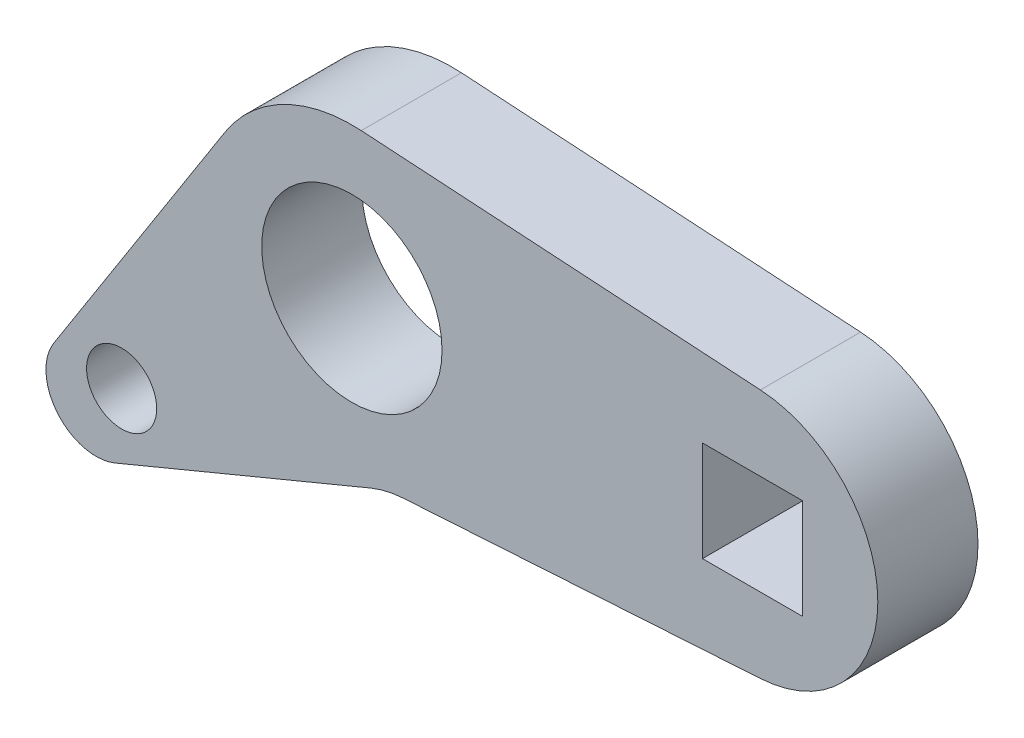
ISO-10303-21;
HEADER;
FILE_DESCRIPTION(('STEP AP214'),'2;1');
FILE_NAME('part.step','',(''),(''),'','','');
FILE_SCHEMA(('AUTOMOTIVE_DESIGN { 1 0 10303 214 1 1 1 1 }'));
ENDSEC;
DATA;
#1=APPLICATION_CONTEXT('core data for automotive mechanical design processes');
#2=APPLICATION_PROTOCOL_DEFINITION('international standard','automotive_design',2000,#1);
#3=PRODUCT_CONTEXT('',#1,'mechanical');
#4=PRODUCT('Part','Part','',(#3));
#5=PRODUCT_RELATED_PRODUCT_CATEGORY('part','',(#4));
#6=PRODUCT_DEFINITION_FORMATION('','',#4);
#7=PRODUCT_DEFINITION_CONTEXT('part definition',#1,'design');
#8=PRODUCT_DEFINITION('design','',#6,#7);
#9=PRODUCT_DEFINITION_SHAPE('','',#8);
#10=(LENGTH_UNIT() NAMED_UNIT(*) SI_UNIT(.MILLI.,.METRE.));
#11=(NAMED_UNIT(*) PLANE_ANGLE_UNIT() SI_UNIT($,.RADIAN.));
#12=(NAMED_UNIT(*) SI_UNIT($,.STERADIAN.) SOLID_ANGLE_UNIT());
#13=UNCERTAINTY_MEASURE_WITH_UNIT(LENGTH_MEASURE(1.E-05),#10,'distance_accuracy_value','');
#14=(GEOMETRIC_REPRESENTATION_CONTEXT(3) GLOBAL_UNCERTAINTY_ASSIGNED_CONTEXT((#13)) GLOBAL_UNIT_ASSIGNED_CONTEXT((#10,
#11,#12)) REPRESENTATION_CONTEXT('',''));
#15=CARTESIAN_POINT('',(0.,0.,0.));
#16=DIRECTION('',(0.,0.,1.));
#17=DIRECTION('',(1.,0.,0.));
#18=AXIS2_PLACEMENT_3D('',#15,#16,#17);
#19=CARTESIAN_POINT('',(45.,0.,10.));
#20=DIRECTION('',(-1.,0.,0.));
#21=DIRECTION('',(0.,0.,1.));
#22=AXIS2_PLACEMENT_3D('',#19,#20,#21);
#23=PLANE('',#22);
#24=DIRECTION('',(0.,1.,0.));
#25=VECTOR('',#24,1.);
#26=CARTESIAN_POINT('',(45.,0.,0.));
#27=LINE('',#26,#25);
#28=CARTESIAN_POINT('',(45.,-5.,0.));
#29=VERTEX_POINT('',#28);
#30=CARTESIAN_POINT('',(45.,5.,0.));
#31=VERTEX_POINT('',#30);
#32=EDGE_CURVE('E200',#29,#31,#27,.T.);
#33=ORIENTED_EDGE('',*,*,#32,.F.);
#34=DIRECTION('',(0.,0.,-1.));
#35=VECTOR('',#34,1.);
#36=CARTESIAN_POINT('',(45.,-5.,10.));
#37=LINE('',#36,#35);
#38=CARTESIAN_POINT('',(45.,-5.,10.));
#39=VERTEX_POINT('',#38);
#40=EDGE_CURVE('E217',#39,#29,#37,.T.);
#41=ORIENTED_EDGE('',*,*,#40,.F.);
#42=DIRECTION('',(0.,1.,0.));
#43=VECTOR('',#42,1.);
#44=CARTESIAN_POINT('',(45.,0.,10.));
#45=LINE('',#44,#43);
#46=CARTESIAN_POINT('',(45.,5.,10.));
#47=VERTEX_POINT('',#46);
#48=EDGE_CURVE('E169',#39,#47,#45,.T.);
#49=ORIENTED_EDGE('',*,*,#48,.T.);
#50=DIRECTION('',(0.,0.,-1.));
#51=VECTOR('',#50,1.);
#52=CARTESIAN_POINT('',(45.,5.,10.));
#53=LINE('',#52,#51);
#54=EDGE_CURVE('E137',#47,#31,#53,.T.);
#55=ORIENTED_EDGE('',*,*,#54,.T.);
#56=EDGE_LOOP('',(#33,#41,#49,#55));
#57=FACE_BOUND('',#56,.T.);
#58=ADVANCED_FACE('F37',(#57),#23,.T.);
#59=CARTESIAN_POINT('',(0.,-5.,10.));
#60=DIRECTION('',(0.,1.,0.));
#61=DIRECTION('',(0.,0.,1.));
#62=AXIS2_PLACEMENT_3D('',#59,#60,#61);
#63=PLANE('',#62);
#64=DIRECTION('',(1.,0.,0.));
#65=VECTOR('',#64,1.);
#66=CARTESIAN_POINT('',(0.,-5.,0.));
#67=LINE('',#66,#65);
#68=CARTESIAN_POINT('',(35.,-5.,0.));
#69=VERTEX_POINT('',#68);
#70=EDGE_CURVE('E203',#69,#29,#67,.T.);
#71=ORIENTED_EDGE('',*,*,#70,.F.);
#72=DIRECTION('',(0.,0.,-1.));
#73=VECTOR('',#72,1.);
#74=CARTESIAN_POINT('',(35.,-5.,10.));
#75=LINE('',#74,#73);
#76=CARTESIAN_POINT('',(35.,-5.,10.));
#77=VERTEX_POINT('',#76);
#78=EDGE_CURVE('E215',#77,#69,#75,.T.);
#79=ORIENTED_EDGE('',*,*,#78,.F.);
#80=DIRECTION('',(1.,0.,0.));
#81=VECTOR('',#80,1.);
#82=CARTESIAN_POINT('',(0.,-5.,10.));
#83=LINE('',#82,#81);
#84=EDGE_CURVE('E172',#77,#39,#83,.T.);
#85=ORIENTED_EDGE('',*,*,#84,.T.);
#86=ORIENTED_EDGE('',*,*,#40,.T.);
#87=EDGE_LOOP('',(#71,#79,#85,#86));
#88=FACE_BOUND('',#87,.T.);
#89=ADVANCED_FACE('F260',(#88),#63,.T.);
#90=CARTESIAN_POINT('',(35.,0.,10.));
#91=DIRECTION('',(-1.,0.,0.));
#92=DIRECTION('',(0.,0.,1.));
#93=AXIS2_PLACEMENT_3D('',#90,#91,#92);
#94=PLANE('',#93);
#95=DIRECTION('',(0.,1.,0.));
#96=VECTOR('',#95,1.);
#97=CARTESIAN_POINT('',(35.,0.,0.));
#98=LINE('',#97,#96);
#99=CARTESIAN_POINT('',(35.,5.,0.));
#100=VERTEX_POINT('',#99);
#101=EDGE_CURVE('E206',#69,#100,#98,.T.);
#102=ORIENTED_EDGE('',*,*,#101,.T.);
#103=DIRECTION('',(0.,0.,-1.));
#104=VECTOR('',#103,1.);
#105=CARTESIAN_POINT('',(35.,5.,10.));
#106=LINE('',#105,#104);
#107=CARTESIAN_POINT('',(35.,5.,10.));
#108=VERTEX_POINT('',#107);
#109=EDGE_CURVE('E212',#108,#100,#106,.T.);
#110=ORIENTED_EDGE('',*,*,#109,.F.);
#111=DIRECTION('',(0.,1.,0.));
#112=VECTOR('',#111,1.);
#113=CARTESIAN_POINT('',(35.,0.,10.));
#114=LINE('',#113,#112);
#115=EDGE_CURVE('E175',#77,#108,#114,.T.);
#116=ORIENTED_EDGE('',*,*,#115,.F.);
#117=ORIENTED_EDGE('',*,*,#78,.T.);
#118=EDGE_LOOP('',(#102,#110,#116,#117));
#119=FACE_BOUND('',#118,.T.);
#120=ADVANCED_FACE('F266',(#119),#94,.F.);
#121=CARTESIAN_POINT('',(5.75050449194089,-13.8539416083715,10.));
#122=DIRECTION('',(-0.383366966129393,0.923596107224768,0.));
#123=DIRECTION('',(-0.923596107224768,-0.383366966129393,0.));
#124=AXIS2_PLACEMENT_3D('',#121,#122,#123);
#125=PLANE('',#124);
#126=DIRECTION('',(0.923596107224768,0.383366966129393,0.));
#127=VECTOR('',#126,1.);
#128=CARTESIAN_POINT('',(5.75050449194089,-13.8539416083715,0.));
#129=LINE('',#128,#127);
#130=CARTESIAN_POINT('',(-23.6179799399856,-26.0442341923419,0.));
#131=VERTEX_POINT('',#130);
#132=CARTESIAN_POINT('',(1.8950565976308,-15.4542638171267,0.));
#133=VERTEX_POINT('',#132);
#134=EDGE_CURVE('E181',#131,#133,#129,.T.);
#135=ORIENTED_EDGE('',*,*,#134,.T.);
#136=DIRECTION('',(0.,0.,-1.));
#137=VECTOR('',#136,1.);
#138=CARTESIAN_POINT('',(1.8950565976308,-15.4542638171267,10.));
#139=LINE('',#138,#137);
#140=CARTESIAN_POINT('',(1.8950565976308,-15.4542638171267,10.));
#141=VERTEX_POINT('',#140);
#142=EDGE_CURVE('E58',#133,#141,#139,.F.);
#143=ORIENTED_EDGE('',*,*,#142,.T.);
#144=DIRECTION('',(0.923596107224768,0.383366966129393,0.));
#145=VECTOR('',#144,1.);
#146=CARTESIAN_POINT('',(5.75050449194089,-13.8539416083715,10.));
#147=LINE('',#146,#145);
#148=CARTESIAN_POINT('',(-23.6179799399856,-26.0442341923419,10.));
#149=VERTEX_POINT('',#148);
#150=EDGE_CURVE('E152',#149,#141,#147,.T.);
#151=ORIENTED_EDGE('',*,*,#150,.F.);
#152=DIRECTION('',(0.,0.,-1.));
#153=VECTOR('',#152,1.);
#154=CARTESIAN_POINT('',(-23.6179799399856,-26.0442341923419,0.));
#155=LINE('',#154,#153);
#156=EDGE_CURVE('E219',#149,#131,#155,.T.);
#157=ORIENTED_EDGE('',*,*,#156,.T.);
#158=EDGE_LOOP('',(#135,#143,#151,#157));
#159=FACE_BOUND('',#158,.T.);
#160=ADVANCED_FACE('F254',(#159),#125,.F.);
#161=CARTESIAN_POINT('',(0.937499999999999,-14.9706744587544,10.));
#162=DIRECTION('',(0.0624999999999999,-0.998044963916957,0.));
#163=DIRECTION('',(0.998044963916957,0.0624999999999999,0.));
#164=AXIS2_PLACEMENT_3D('',#161,#162,#163);
#165=PLANE('',#164);
#166=DIRECTION('',(-0.998044963916957,-0.0624999999999999,0.));
#167=VECTOR('',#166,1.);
#168=CARTESIAN_POINT('',(0.937499999999999,-14.9706744587544,10.));
#169=LINE('',#168,#167);
#170=CARTESIAN_POINT('',(40.78125,-12.475562048962,10.));
#171=VERTEX_POINT('',#170);
#172=CARTESIAN_POINT('',(5.10372625892473,-14.7097752502048,10.));
#173=VERTEX_POINT('',#172);
#174=EDGE_CURVE('E131',#171,#173,#169,.T.);
#175=ORIENTED_EDGE('',*,*,#174,.T.);
#176=DIRECTION('',(0.,0.,-1.));
#177=VECTOR('',#176,1.);
#178=CARTESIAN_POINT('',(5.10372625892473,-14.7097752502048,10.));
#179=LINE('',#178,#177);
#180=CARTESIAN_POINT('',(5.10372625892473,-14.7097752502048,0.));
#181=VERTEX_POINT('',#180);
#182=EDGE_CURVE('E233',#173,#181,#179,.T.);
#183=ORIENTED_EDGE('',*,*,#182,.T.);
#184=DIRECTION('',(-0.998044963916957,-0.0624999999999999,0.));
#185=VECTOR('',#184,1.);
#186=CARTESIAN_POINT('',(0.937499999999999,-14.9706744587544,0.));
#187=LINE('',#186,#185);
#188=CARTESIAN_POINT('',(40.78125,-12.475562048962,0.));
#189=VERTEX_POINT('',#188);
#190=EDGE_CURVE('E133',#189,#181,#187,.T.);
#191=ORIENTED_EDGE('',*,*,#190,.F.);
#192=DIRECTION('',(0.,0.,-1.));
#193=VECTOR('',#192,1.);
#194=CARTESIAN_POINT('',(40.78125,-12.475562048962,10.));
#195=LINE('',#194,#193);
#196=EDGE_CURVE('E126',#171,#189,#195,.T.);
#197=ORIENTED_EDGE('',*,*,#196,.F.);
#198=EDGE_LOOP('',(#175,#183,#191,#197));
#199=FACE_BOUND('',#198,.T.);
#200=ADVANCED_FACE('F128',(#199),#165,.T.);
#201=CARTESIAN_POINT('',(40.,0.,10.));
#202=DIRECTION('',(0.,0.,-1.));
#203=DIRECTION('',(-1.,0.,0.));
#204=AXIS2_PLACEMENT_3D('',#201,#202,#203);
#205=CYLINDRICAL_SURFACE('',#204,12.5);
#206=CARTESIAN_POINT('',(40.,0.,0.));
#207=DIRECTION('',(0.,0.,1.));
#208=DIRECTION('',(1.,0.,0.));
#209=AXIS2_PLACEMENT_3D('',#206,#207,#208);
#210=CIRCLE('',#209,12.5);
#211=CARTESIAN_POINT('',(40.78125,12.475562048962,0.));
#212=VERTEX_POINT('',#211);
#213=EDGE_CURVE('E184',#189,#212,#210,.T.);
#214=ORIENTED_EDGE('',*,*,#213,.T.);
#215=DIRECTION('',(0.,0.,-1.));
#216=VECTOR('',#215,1.);
#217=CARTESIAN_POINT('',(40.78125,12.475562048962,10.));
#218=LINE('',#217,#216);
#219=CARTESIAN_POINT('',(40.78125,12.475562048962,10.));
#220=VERTEX_POINT('',#219);
#221=EDGE_CURVE('E138',#220,#212,#218,.T.);
#222=ORIENTED_EDGE('',*,*,#221,.F.);
#223=CARTESIAN_POINT('',(40.,0.,10.));
#224=DIRECTION('',(0.,0.,1.));
#225=DIRECTION('',(1.,0.,0.));
#226=AXIS2_PLACEMENT_3D('',#223,#224,#225);
#227=CIRCLE('',#226,12.5);
#228=EDGE_CURVE('E141',#171,#220,#227,.T.);
#229=ORIENTED_EDGE('',*,*,#228,.F.);
#230=ORIENTED_EDGE('',*,*,#196,.T.);
#231=EDGE_LOOP('',(#214,#222,#229,#230));
#232=FACE_BOUND('',#231,.T.);
#233=ADVANCED_FACE('F142',(#232),#205,.T.);
#234=CARTESIAN_POINT('',(0.937499999999999,14.9706744587544,10.));
#235=DIRECTION('',(0.0624999999999999,0.998044963916957,0.));
#236=DIRECTION('',(-0.998044963916957,0.0624999999999999,0.));
#237=AXIS2_PLACEMENT_3D('',#234,#235,#236);
#238=PLANE('',#237);
#239=DIRECTION('',(0.998044963916957,-0.0624999999999999,0.));
#240=VECTOR('',#239,1.);
#241=CARTESIAN_POINT('',(0.937499999999999,14.9706744587544,0.));
#242=LINE('',#241,#240);
#243=CARTESIAN_POINT('',(0.937499999999999,14.9706744587544,0.));
#244=VERTEX_POINT('',#243);
#245=EDGE_CURVE('E186',#244,#212,#242,.T.);
#246=ORIENTED_EDGE('',*,*,#245,.F.);
#247=DIRECTION('',(0.,0.,-1.));
#248=VECTOR('',#247,1.);
#249=CARTESIAN_POINT('',(0.937499999999999,14.9706744587544,10.));
#250=LINE('',#249,#248);
#251=CARTESIAN_POINT('',(0.937499999999999,14.9706744587544,10.));
#252=VERTEX_POINT('',#251);
#253=EDGE_CURVE('E222',#252,#244,#250,.T.);
#254=ORIENTED_EDGE('',*,*,#253,.F.);
#255=DIRECTION('',(0.998044963916957,-0.0624999999999999,0.));
#256=VECTOR('',#255,1.);
#257=CARTESIAN_POINT('',(0.937499999999999,14.9706744587544,10.));
#258=LINE('',#257,#256);
#259=EDGE_CURVE('E146',#252,#220,#258,.T.);
#260=ORIENTED_EDGE('',*,*,#259,.T.);
#261=ORIENTED_EDGE('',*,*,#221,.T.);
#262=EDGE_LOOP('',(#246,#254,#260,#261));
#263=FACE_BOUND('',#262,.T.);
#264=ADVANCED_FACE('F241',(#263),#238,.T.);
#265=CARTESIAN_POINT('',(0.,0.,10.));
#266=DIRECTION('',(0.,0.,-1.));
#267=DIRECTION('',(-1.,0.,0.));
#268=AXIS2_PLACEMENT_3D('',#265,#266,#267);
#269=CYLINDRICAL_SURFACE('',#268,15.);
#270=CARTESIAN_POINT('',(0.,0.,0.));
#271=DIRECTION('',(0.,0.,1.));
#272=DIRECTION('',(1.,0.,0.));
#273=AXIS2_PLACEMENT_3D('',#270,#271,#272);
#274=CIRCLE('',#273,15.);
#275=CARTESIAN_POINT('',(-12.6449044800117,8.06885312119266,0.));
#276=VERTEX_POINT('',#275);
#277=EDGE_CURVE('E189',#244,#276,#274,.T.);
#278=ORIENTED_EDGE('',*,*,#277,.T.);
#279=DIRECTION('',(0.,0.,-1.));
#280=VECTOR('',#279,1.);
#281=CARTESIAN_POINT('',(-12.6449044800117,8.06885312119266,10.));
#282=LINE('',#281,#280);
#283=CARTESIAN_POINT('',(-12.6449044800117,8.06885312119266,10.));
#284=VERTEX_POINT('',#283);
#285=EDGE_CURVE('E180',#284,#276,#282,.T.);
#286=ORIENTED_EDGE('',*,*,#285,.F.);
#287=CARTESIAN_POINT('',(0.,0.,10.));
#288=DIRECTION('',(0.,0.,1.));
#289=DIRECTION('',(1.,0.,0.));
#290=AXIS2_PLACEMENT_3D('',#287,#288,#289);
#291=CIRCLE('',#290,15.);
#292=EDGE_CURVE('E158',#252,#284,#291,.T.);
#293=ORIENTED_EDGE('',*,*,#292,.F.);
#294=ORIENTED_EDGE('',*,*,#253,.T.);
#295=EDGE_LOOP('',(#278,#286,#293,#294));
#296=FACE_BOUND('',#295,.T.);
#297=ADVANCED_FACE('F246',(#296),#269,.T.);
#298=CARTESIAN_POINT('',(-22.9813332935693,-19.2836282905962,10.));
#299=DIRECTION('',(0.,0.,-1.));
#300=DIRECTION('',(-1.,0.,0.));
#301=AXIS2_PLACEMENT_3D('',#298,#299,#300);
#302=CYLINDRICAL_SURFACE('',#301,3.5);
#303=CARTESIAN_POINT('',(-22.9813332935693,-19.2836282905962,10.));
#304=DIRECTION('',(0.,0.,1.));
#305=DIRECTION('',(1.,0.,0.));
#306=AXIS2_PLACEMENT_3D('',#303,#304,#305);
#307=CIRCLE('',#306,3.5);
#308=CARTESIAN_POINT('',(-19.4813332935693,-19.2836282905962,10.));
#309=VERTEX_POINT('',#308);
#310=EDGE_CURVE('E166',#309,#309,#307,.T.);
#311=ORIENTED_EDGE('',*,*,#310,.T.);
#312=EDGE_LOOP('',(#311));
#313=FACE_BOUND('',#312,.T.);
#314=CARTESIAN_POINT('',(-22.9813332935693,-19.2836282905962,0.));
#315=DIRECTION('',(0.,0.,1.));
#316=DIRECTION('',(1.,0.,0.));
#317=AXIS2_PLACEMENT_3D('',#314,#315,#316);
#318=CIRCLE('',#317,3.5);
#319=CARTESIAN_POINT('',(-19.4813332935693,-19.2836282905962,0.));
#320=VERTEX_POINT('',#319);
#321=EDGE_CURVE('E197',#320,#320,#318,.T.);
#322=ORIENTED_EDGE('',*,*,#321,.F.);
#323=EDGE_LOOP('',(#322));
#324=FACE_BOUND('',#323,.T.);
#325=ADVANCED_FACE('F272',(#313,#324),#302,.F.);
#326=CARTESIAN_POINT('',(0.,0.,10.));
#327=DIRECTION('',(0.,0.,-1.));
#328=DIRECTION('',(-1.,0.,0.));
#329=AXIS2_PLACEMENT_3D('',#326,#327,#328);
#330=CYLINDRICAL_SURFACE('',#329,9.);
#331=CARTESIAN_POINT('',(0.,0.,10.));
#332=DIRECTION('',(0.,0.,1.));
#333=DIRECTION('',(1.,0.,0.));
#334=AXIS2_PLACEMENT_3D('',#331,#332,#333);
#335=CIRCLE('',#334,9.);
#336=CARTESIAN_POINT('',(9.,0.,10.));
#337=VERTEX_POINT('',#336);
#338=EDGE_CURVE('E163',#337,#337,#335,.T.);
#339=ORIENTED_EDGE('',*,*,#338,.T.);
#340=EDGE_LOOP('',(#339));
#341=FACE_BOUND('',#340,.T.);
#342=CARTESIAN_POINT('',(0.,0.,0.));
#343=DIRECTION('',(0.,0.,1.));
#344=DIRECTION('',(1.,0.,0.));
#345=AXIS2_PLACEMENT_3D('',#342,#343,#344);
#346=CIRCLE('',#345,9.);
#347=CARTESIAN_POINT('',(9.,0.,0.));
#348=VERTEX_POINT('',#347);
#349=EDGE_CURVE('E194',#348,#348,#346,.T.);
#350=ORIENTED_EDGE('',*,*,#349,.F.);
#351=EDGE_LOOP('',(#350));
#352=FACE_BOUND('',#351,.T.);
#353=ADVANCED_FACE('F275',(#341,#352),#330,.F.);
#354=CARTESIAN_POINT('',(-12.6449044800117,8.06885312119266,10.));
#355=DIRECTION('',(-0.842993632000779,0.537923541412844,0.));
#356=DIRECTION('',(-0.537923541412844,-0.842993632000779,0.));
#357=AXIS2_PLACEMENT_3D('',#354,#355,#356);
#358=PLANE('',#357);
#359=DIRECTION('',(0.537923541412844,0.842993632000779,0.));
#360=VECTOR('',#359,1.);
#361=CARTESIAN_POINT('',(-12.6449044800117,8.06885312119266,0.));
#362=LINE('',#361,#360);
#363=CARTESIAN_POINT('',(-29.7497829306365,-18.7366359491538,0.));
#364=VERTEX_POINT('',#363);
#365=EDGE_CURVE('E192',#364,#276,#362,.T.);
#366=ORIENTED_EDGE('',*,*,#365,.F.);
#367=DIRECTION('',(0.,0.,-1.));
#368=VECTOR('',#367,1.);
#369=CARTESIAN_POINT('',(-29.7497829306365,-18.7366359491538,10.));
#370=LINE('',#369,#368);
#371=CARTESIAN_POINT('',(-29.7497829306365,-18.7366359491538,10.));
#372=VERTEX_POINT('',#371);
#373=EDGE_CURVE('E229',#364,#372,#370,.F.);
#374=ORIENTED_EDGE('',*,*,#373,.T.);
#375=DIRECTION('',(0.537923541412844,0.842993632000779,0.));
#376=VECTOR('',#375,1.);
#377=CARTESIAN_POINT('',(-12.6449044800117,8.06885312119266,10.));
#378=LINE('',#377,#376);
#379=EDGE_CURVE('E161',#372,#284,#378,.T.);
#380=ORIENTED_EDGE('',*,*,#379,.T.);
#381=ORIENTED_EDGE('',*,*,#285,.T.);
#382=EDGE_LOOP('',(#366,#374,#380,#381));
#383=FACE_BOUND('',#382,.T.);
#384=ADVANCED_FACE('F249',(#383),#358,.T.);
#385=CARTESIAN_POINT('',(0.,5.,10.));
#386=DIRECTION('',(0.,1.,0.));
#387=DIRECTION('',(0.,0.,1.));
#388=AXIS2_PLACEMENT_3D('',#385,#386,#387);
#389=PLANE('',#388);
#390=DIRECTION('',(1.,0.,0.));
#391=VECTOR('',#390,1.);
#392=CARTESIAN_POINT('',(0.,5.,0.));
#393=LINE('',#392,#391);
#394=EDGE_CURVE('E154',#100,#31,#393,.T.);
#395=ORIENTED_EDGE('',*,*,#394,.T.);
#396=ORIENTED_EDGE('',*,*,#54,.F.);
#397=DIRECTION('',(1.,0.,0.));
#398=VECTOR('',#397,1.);
#399=CARTESIAN_POINT('',(0.,5.,10.));
#400=LINE('',#399,#398);
#401=EDGE_CURVE('E178',#108,#47,#400,.T.);
#402=ORIENTED_EDGE('',*,*,#401,.F.);
#403=ORIENTED_EDGE('',*,*,#109,.T.);
#404=EDGE_LOOP('',(#395,#396,#402,#403));
#405=FACE_BOUND('',#404,.T.);
#406=ADVANCED_FACE('F282',(#405),#389,.F.);
#407=CARTESIAN_POINT('',(0.,0.,10.));
#408=DIRECTION('',(0.,0.,1.));
#409=DIRECTION('',(1.,0.,0.));
#410=AXIS2_PLACEMENT_3D('',#407,#408,#409);
#411=PLANE('',#410);
#412=ORIENTED_EDGE('',*,*,#379,.F.);
#413=CARTESIAN_POINT('',(-25.5348147706326,-21.426253656218,10.));
#414=DIRECTION('',(0.,0.,1.));
#415=DIRECTION('',(1.,0.,0.));
#416=AXIS2_PLACEMENT_3D('',#413,#414,#415);
#417=CIRCLE('',#416,5.);
#418=EDGE_CURVE('E231',#372,#149,#417,.T.);
#419=ORIENTED_EDGE('',*,*,#418,.T.);
#420=ORIENTED_EDGE('',*,*,#150,.T.);
#421=CARTESIAN_POINT('',(5.72872625892473,-24.6902248893744,10.));
#422=DIRECTION('',(0.,0.,1.));
#423=DIRECTION('',(1.,0.,0.));
#424=AXIS2_PLACEMENT_3D('',#421,#422,#423);
#425=CIRCLE('',#424,10.);
#426=EDGE_CURVE('E11',#141,#173,#425,.F.);
#427=ORIENTED_EDGE('',*,*,#426,.T.);
#428=ORIENTED_EDGE('',*,*,#174,.F.);
#429=ORIENTED_EDGE('',*,*,#228,.T.);
#430=ORIENTED_EDGE('',*,*,#259,.F.);
#431=ORIENTED_EDGE('',*,*,#292,.T.);
#432=EDGE_LOOP('',(#412,#419,#420,#427,#428,#429,#430,#431));
#433=FACE_BOUND('',#432,.T.);
#434=ORIENTED_EDGE('',*,*,#338,.F.);
#435=EDGE_LOOP('',(#434));
#436=FACE_BOUND('',#435,.T.);
#437=ORIENTED_EDGE('',*,*,#310,.F.);
#438=EDGE_LOOP('',(#437));
#439=FACE_BOUND('',#438,.T.);
#440=ORIENTED_EDGE('',*,*,#48,.F.);
#441=ORIENTED_EDGE('',*,*,#84,.F.);
#442=ORIENTED_EDGE('',*,*,#115,.T.);
#443=ORIENTED_EDGE('',*,*,#401,.T.);
#444=EDGE_LOOP('',(#440,#441,#442,#443));
#445=FACE_BOUND('',#444,.T.);
#446=ADVANCED_FACE('F149',(#433,#436,#439,#445),#411,.T.);
#447=CARTESIAN_POINT('',(0.,0.,0.));
#448=DIRECTION('',(0.,0.,1.));
#449=DIRECTION('',(1.,0.,0.));
#450=AXIS2_PLACEMENT_3D('',#447,#448,#449);
#451=PLANE('',#450);
#452=ORIENTED_EDGE('',*,*,#134,.F.);
#453=CARTESIAN_POINT('',(-25.5348147706326,-21.426253656218,0.));
#454=DIRECTION('',(0.,0.,1.));
#455=DIRECTION('',(1.,0.,0.));
#456=AXIS2_PLACEMENT_3D('',#453,#454,#455);
#457=CIRCLE('',#456,5.);
#458=EDGE_CURVE('E227',#131,#364,#457,.F.);
#459=ORIENTED_EDGE('',*,*,#458,.T.);
#460=ORIENTED_EDGE('',*,*,#365,.T.);
#461=ORIENTED_EDGE('',*,*,#277,.F.);
#462=ORIENTED_EDGE('',*,*,#245,.T.);
#463=ORIENTED_EDGE('',*,*,#213,.F.);
#464=ORIENTED_EDGE('',*,*,#190,.T.);
#465=CARTESIAN_POINT('',(5.72872625892473,-24.6902248893744,0.));
#466=DIRECTION('',(0.,0.,1.));
#467=DIRECTION('',(1.,0.,0.));
#468=AXIS2_PLACEMENT_3D('',#465,#466,#467);
#469=CIRCLE('',#468,10.);
#470=EDGE_CURVE('E45',#181,#133,#469,.T.);
#471=ORIENTED_EDGE('',*,*,#470,.T.);
#472=EDGE_LOOP('',(#452,#459,#460,#461,#462,#463,#464,#471));
#473=FACE_BOUND('',#472,.T.);
#474=ORIENTED_EDGE('',*,*,#349,.T.);
#475=EDGE_LOOP('',(#474));
#476=FACE_BOUND('',#475,.T.);
#477=ORIENTED_EDGE('',*,*,#321,.T.);
#478=EDGE_LOOP('',(#477));
#479=FACE_BOUND('',#478,.T.);
#480=ORIENTED_EDGE('',*,*,#32,.T.);
#481=ORIENTED_EDGE('',*,*,#394,.F.);
#482=ORIENTED_EDGE('',*,*,#101,.F.);
#483=ORIENTED_EDGE('',*,*,#70,.T.);
#484=EDGE_LOOP('',(#480,#481,#482,#483));
#485=FACE_BOUND('',#484,.T.);
#486=ADVANCED_FACE('F236',(#473,#476,#479,#485),#451,.F.);
#487=CARTESIAN_POINT('',(-25.5348147706326,-21.426253656218,10.));
#488=DIRECTION('',(0.,0.,1.));
#489=DIRECTION('',(1.,0.,0.));
#490=AXIS2_PLACEMENT_3D('',#487,#488,#489);
#491=CYLINDRICAL_SURFACE('',#490,5.);
#492=ORIENTED_EDGE('',*,*,#418,.F.);
#493=ORIENTED_EDGE('',*,*,#373,.F.);
#494=ORIENTED_EDGE('',*,*,#458,.F.);
#495=ORIENTED_EDGE('',*,*,#156,.F.);
#496=EDGE_LOOP('',(#492,#493,#494,#495));
#497=FACE_BOUND('',#496,.T.);
#498=ADVANCED_FACE('F252',(#497),#491,.T.);
#499=CARTESIAN_POINT('',(5.72872625892473,-24.6902248893744,10.));
#500=DIRECTION('',(0.,0.,-1.));
#501=DIRECTION('',(-1.,0.,0.));
#502=AXIS2_PLACEMENT_3D('',#499,#500,#501);
#503=CYLINDRICAL_SURFACE('',#502,10.);
#504=ORIENTED_EDGE('',*,*,#426,.F.);
#505=ORIENTED_EDGE('',*,*,#142,.F.);
#506=ORIENTED_EDGE('',*,*,#470,.F.);
#507=ORIENTED_EDGE('',*,*,#182,.F.);
#508=EDGE_LOOP('',(#504,#505,#506,#507));
#509=FACE_BOUND('',#508,.T.);
#510=ADVANCED_FACE('F39',(#509),#503,.F.);
#511=CLOSED_SHELL('',(#58,#89,#120,#160,#200,#233,#264,#297,#325,#353,#384,#406,#446,#486,#498,#510));
#512=MANIFOLD_SOLID_BREP('B2',#511);
#513=ADVANCED_BREP_SHAPE_REPRESENTATION('',(#18,#512),#14);
#514=SHAPE_DEFINITION_REPRESENTATION(#9,#513);
ENDSEC;
END-ISO-10303-21;
